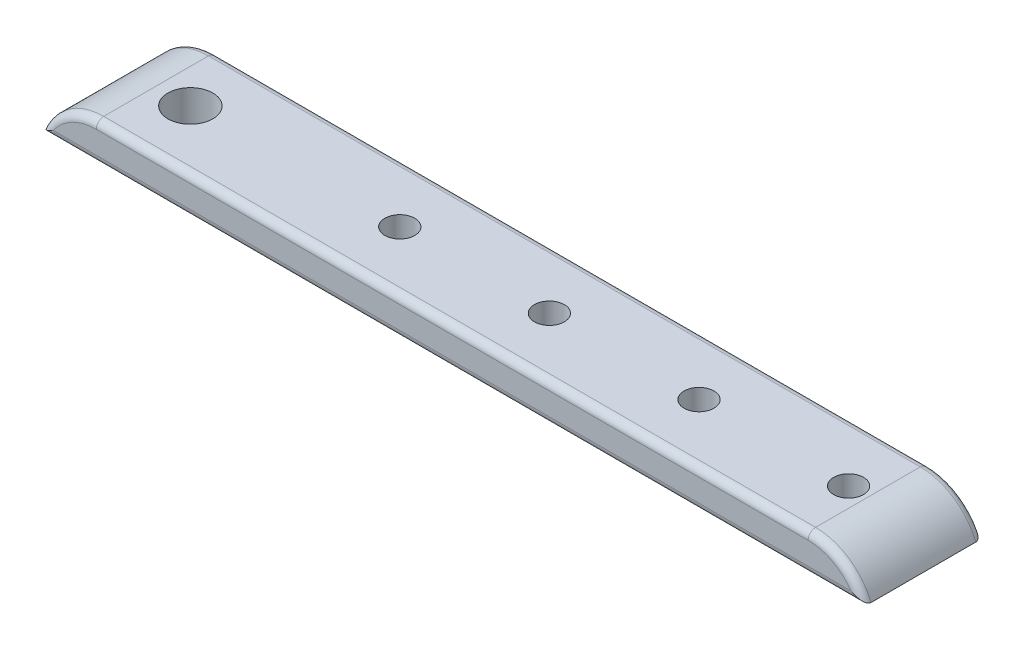
ISO-10303-21;
HEADER;
FILE_DESCRIPTION(('STEP AP214'),'2;1');
FILE_NAME('part.step','',(''),(''),'','','');
FILE_SCHEMA(('AUTOMOTIVE_DESIGN { 1 0 10303 214 1 1 1 1 }'));
ENDSEC;
DATA;
#1=APPLICATION_CONTEXT('core data for automotive mechanical design processes');
#2=APPLICATION_PROTOCOL_DEFINITION('international standard','automotive_design',2000,#1);
#3=PRODUCT_CONTEXT('',#1,'mechanical');
#4=PRODUCT('Part','Part','',(#3));
#5=PRODUCT_RELATED_PRODUCT_CATEGORY('part','',(#4));
#6=PRODUCT_DEFINITION_FORMATION('','',#4);
#7=PRODUCT_DEFINITION_CONTEXT('part definition',#1,'design');
#8=PRODUCT_DEFINITION('design','',#6,#7);
#9=PRODUCT_DEFINITION_SHAPE('','',#8);
#10=(LENGTH_UNIT() NAMED_UNIT(*) SI_UNIT(.MILLI.,.METRE.));
#11=(NAMED_UNIT(*) PLANE_ANGLE_UNIT() SI_UNIT($,.RADIAN.));
#12=(NAMED_UNIT(*) SI_UNIT($,.STERADIAN.) SOLID_ANGLE_UNIT());
#13=UNCERTAINTY_MEASURE_WITH_UNIT(LENGTH_MEASURE(1.E-05),#10,'distance_accuracy_value','');
#14=(GEOMETRIC_REPRESENTATION_CONTEXT(3) GLOBAL_UNCERTAINTY_ASSIGNED_CONTEXT((#13)) GLOBAL_UNIT_ASSIGNED_CONTEXT((#10,
#11,#12)) REPRESENTATION_CONTEXT('',''));
#15=CARTESIAN_POINT('',(0.,0.,0.));
#16=DIRECTION('',(0.,0.,1.));
#17=DIRECTION('',(1.,0.,0.));
#18=AXIS2_PLACEMENT_3D('',#15,#16,#17);
#19=CARTESIAN_POINT('',(-55.,5.,-8.));
#20=DIRECTION('',(0.,0.,1.));
#21=DIRECTION('',(1.,0.,0.));
#22=AXIS2_PLACEMENT_3D('',#19,#20,#21);
#23=PLANE('',#22);
#24=CARTESIAN_POINT('',(47.5838015129044,-3.,-8.));
#25=DIRECTION('',(0.,0.,1.));
#26=DIRECTION('',(1.,0.,0.));
#27=AXIS2_PLACEMENT_3D('',#24,#25,#26);
#28=CIRCLE('',#27,7.);
#29=CARTESIAN_POINT('',(47.5838015129044,4.,-8.));
#30=VERTEX_POINT('',#29);
#31=CARTESIAN_POINT('',(53.3283641594424,1.,-8.));
#32=VERTEX_POINT('',#31);
#33=EDGE_CURVE('E157',#30,#32,#28,.F.);
#34=ORIENTED_EDGE('',*,*,#33,.T.);
#35=DIRECTION('',(-1.,0.,0.));
#36=VECTOR('',#35,1.);
#37=CARTESIAN_POINT('',(-55.,1.,-8.));
#38=LINE('',#37,#36);
#39=CARTESIAN_POINT('',(-53.3283641594423,1.,-8.));
#40=VERTEX_POINT('',#39);
#41=EDGE_CURVE('E65',#32,#40,#38,.T.);
#42=ORIENTED_EDGE('',*,*,#41,.T.);
#43=CARTESIAN_POINT('',(-47.5838015129043,-3.,-8.));
#44=DIRECTION('',(0.,0.,1.));
#45=DIRECTION('',(1.,0.,0.));
#46=AXIS2_PLACEMENT_3D('',#43,#44,#45);
#47=CIRCLE('',#46,7.);
#48=CARTESIAN_POINT('',(-47.5838015129043,4.,-8.));
#49=VERTEX_POINT('',#48);
#50=EDGE_CURVE('E155',#40,#49,#47,.F.);
#51=ORIENTED_EDGE('',*,*,#50,.T.);
#52=DIRECTION('',(-1.,0.,0.));
#53=VECTOR('',#52,1.);
#54=CARTESIAN_POINT('',(47.5838015129044,4.,-8.));
#55=LINE('',#54,#53);
#56=EDGE_CURVE('E153',#49,#30,#55,.F.);
#57=ORIENTED_EDGE('',*,*,#56,.T.);
#58=EDGE_LOOP('',(#34,#42,#51,#57));
#59=FACE_BOUND('',#58,.T.);
#60=ADVANCED_FACE('F41',(#59),#23,.F.);
#61=CARTESIAN_POINT('',(-55.,5.,8.));
#62=DIRECTION('',(0.,0.,-1.));
#63=DIRECTION('',(-1.,0.,0.));
#64=AXIS2_PLACEMENT_3D('',#61,#62,#63);
#65=PLANE('',#64);
#66=CARTESIAN_POINT('',(-47.5838015129043,-3.,8.));
#67=DIRECTION('',(0.,0.,-1.));
#68=DIRECTION('',(-1.,0.,0.));
#69=AXIS2_PLACEMENT_3D('',#66,#67,#68);
#70=CIRCLE('',#69,7.);
#71=CARTESIAN_POINT('',(-47.5838015129043,4.,8.));
#72=VERTEX_POINT('',#71);
#73=CARTESIAN_POINT('',(-53.3283641594423,1.,8.));
#74=VERTEX_POINT('',#73);
#75=EDGE_CURVE('E120',#72,#74,#70,.F.);
#76=ORIENTED_EDGE('',*,*,#75,.T.);
#77=DIRECTION('',(1.,0.,0.));
#78=VECTOR('',#77,1.);
#79=CARTESIAN_POINT('',(-55.,1.,8.));
#80=LINE('',#79,#78);
#81=CARTESIAN_POINT('',(53.3283641594424,1.,8.));
#82=VERTEX_POINT('',#81);
#83=EDGE_CURVE('E116',#74,#82,#80,.T.);
#84=ORIENTED_EDGE('',*,*,#83,.T.);
#85=CARTESIAN_POINT('',(47.5838015129044,-3.,8.));
#86=DIRECTION('',(0.,0.,-1.));
#87=DIRECTION('',(-1.,0.,0.));
#88=AXIS2_PLACEMENT_3D('',#85,#86,#87);
#89=CIRCLE('',#88,7.);
#90=CARTESIAN_POINT('',(47.5838015129044,4.,8.));
#91=VERTEX_POINT('',#90);
#92=EDGE_CURVE('E108',#82,#91,#89,.F.);
#93=ORIENTED_EDGE('',*,*,#92,.T.);
#94=DIRECTION('',(1.,0.,0.));
#95=VECTOR('',#94,1.);
#96=CARTESIAN_POINT('',(-47.5838015129043,4.,8.));
#97=LINE('',#96,#95);
#98=EDGE_CURVE('E113',#91,#72,#97,.F.);
#99=ORIENTED_EDGE('',*,*,#98,.T.);
#100=EDGE_LOOP('',(#76,#84,#93,#99));
#101=FACE_BOUND('',#100,.T.);
#102=ADVANCED_FACE('F111',(#101),#65,.F.);
#103=CARTESIAN_POINT('',(0.,5.,0.));
#104=DIRECTION('',(0.,1.,0.));
#105=DIRECTION('',(0.,0.,1.));
#106=AXIS2_PLACEMENT_3D('',#103,#104,#105);
#107=PLANE('',#106);
#108=CARTESIAN_POINT('',(-15.,5.,0.));
#109=DIRECTION('',(0.,1.,0.));
#110=DIRECTION('',(0.,0.,1.));
#111=AXIS2_PLACEMENT_3D('',#108,#109,#110);
#112=CIRCLE('',#111,2.);
#113=CARTESIAN_POINT('',(-15.,5.,2.));
#114=VERTEX_POINT('',#113);
#115=EDGE_CURVE('E270',#114,#114,#112,.T.);
#116=ORIENTED_EDGE('',*,*,#115,.F.);
#117=EDGE_LOOP('',(#116));
#118=FACE_BOUND('',#117,.T.);
#119=CARTESIAN_POINT('',(5.,5.,0.));
#120=DIRECTION('',(0.,1.,0.));
#121=DIRECTION('',(0.,0.,1.));
#122=AXIS2_PLACEMENT_3D('',#119,#120,#121);
#123=CIRCLE('',#122,2.);
#124=CARTESIAN_POINT('',(5.,5.,2.));
#125=VERTEX_POINT('',#124);
#126=EDGE_CURVE('E267',#125,#125,#123,.T.);
#127=ORIENTED_EDGE('',*,*,#126,.F.);
#128=EDGE_LOOP('',(#127));
#129=FACE_BOUND('',#128,.T.);
#130=CARTESIAN_POINT('',(25.,5.,0.));
#131=DIRECTION('',(0.,1.,0.));
#132=DIRECTION('',(0.,0.,1.));
#133=AXIS2_PLACEMENT_3D('',#130,#131,#132);
#134=CIRCLE('',#133,2.);
#135=CARTESIAN_POINT('',(25.,5.,2.));
#136=VERTEX_POINT('',#135);
#137=EDGE_CURVE('E261',#136,#136,#134,.T.);
#138=ORIENTED_EDGE('',*,*,#137,.F.);
#139=EDGE_LOOP('',(#138));
#140=FACE_BOUND('',#139,.T.);
#141=CARTESIAN_POINT('',(45.,5.,0.));
#142=DIRECTION('',(0.,1.,0.));
#143=DIRECTION('',(0.,0.,1.));
#144=AXIS2_PLACEMENT_3D('',#141,#142,#143);
#145=CIRCLE('',#144,2.);
#146=CARTESIAN_POINT('',(45.,5.,2.));
#147=VERTEX_POINT('',#146);
#148=EDGE_CURVE('E255',#147,#147,#145,.T.);
#149=ORIENTED_EDGE('',*,*,#148,.F.);
#150=EDGE_LOOP('',(#149));
#151=FACE_BOUND('',#150,.T.);
#152=CARTESIAN_POINT('',(-43.,5.,0.));
#153=DIRECTION('',(0.,1.,0.));
#154=DIRECTION('',(0.,0.,1.));
#155=AXIS2_PLACEMENT_3D('',#152,#153,#154);
#156=CIRCLE('',#155,3.);
#157=CARTESIAN_POINT('',(-43.,5.,3.));
#158=VERTEX_POINT('',#157);
#159=EDGE_CURVE('E247',#158,#158,#156,.T.);
#160=ORIENTED_EDGE('',*,*,#159,.F.);
#161=EDGE_LOOP('',(#160));
#162=FACE_BOUND('',#161,.T.);
#163=DIRECTION('',(0.,0.,-1.));
#164=VECTOR('',#163,1.);
#165=CARTESIAN_POINT('',(-47.5838015129043,5.,8.));
#166=LINE('',#165,#164);
#167=CARTESIAN_POINT('',(-47.5838015129043,5.,-7.));
#168=VERTEX_POINT('',#167);
#169=CARTESIAN_POINT('',(-47.5838015129043,5.,7.));
#170=VERTEX_POINT('',#169);
#171=EDGE_CURVE('E138',#168,#170,#166,.F.);
#172=ORIENTED_EDGE('',*,*,#171,.T.);
#173=DIRECTION('',(1.,0.,0.));
#174=VECTOR('',#173,1.);
#175=CARTESIAN_POINT('',(47.5838015129044,5.,7.));
#176=LINE('',#175,#174);
#177=CARTESIAN_POINT('',(47.5838015129044,5.,7.));
#178=VERTEX_POINT('',#177);
#179=EDGE_CURVE('E11',#170,#178,#176,.T.);
#180=ORIENTED_EDGE('',*,*,#179,.T.);
#181=DIRECTION('',(0.,0.,1.));
#182=VECTOR('',#181,1.);
#183=CARTESIAN_POINT('',(47.5838015129044,5.,-7.99999999999999));
#184=LINE('',#183,#182);
#185=CARTESIAN_POINT('',(47.5838015129044,5.,-7.));
#186=VERTEX_POINT('',#185);
#187=EDGE_CURVE('E135',#178,#186,#184,.F.);
#188=ORIENTED_EDGE('',*,*,#187,.T.);
#189=DIRECTION('',(-1.,0.,0.));
#190=VECTOR('',#189,1.);
#191=CARTESIAN_POINT('',(-47.5838015129043,5.,-7.));
#192=LINE('',#191,#190);
#193=EDGE_CURVE('E50',#186,#168,#192,.T.);
#194=ORIENTED_EDGE('',*,*,#193,.T.);
#195=EDGE_LOOP('',(#172,#180,#188,#194));
#196=FACE_BOUND('',#195,.T.);
#197=ADVANCED_FACE('F230',(#118,#129,#140,#151,#162,#196),#107,.T.);
#198=CARTESIAN_POINT('',(0.,0.,0.));
#199=DIRECTION('',(0.,1.,0.));
#200=DIRECTION('',(0.,0.,1.));
#201=AXIS2_PLACEMENT_3D('',#198,#199,#200);
#202=PLANE('',#201);
#203=CARTESIAN_POINT('',(-15.,0.,0.));
#204=DIRECTION('',(0.,1.,0.));
#205=DIRECTION('',(0.,0.,1.));
#206=AXIS2_PLACEMENT_3D('',#203,#204,#205);
#207=CIRCLE('',#206,2.);
#208=CARTESIAN_POINT('',(-15.,0.,2.));
#209=VERTEX_POINT('',#208);
#210=EDGE_CURVE('E251',#209,#209,#207,.T.);
#211=ORIENTED_EDGE('',*,*,#210,.T.);
#212=EDGE_LOOP('',(#211));
#213=FACE_BOUND('',#212,.T.);
#214=CARTESIAN_POINT('',(5.,0.,0.));
#215=DIRECTION('',(0.,1.,0.));
#216=DIRECTION('',(0.,0.,1.));
#217=AXIS2_PLACEMENT_3D('',#214,#215,#216);
#218=CIRCLE('',#217,2.);
#219=CARTESIAN_POINT('',(5.,0.,2.));
#220=VERTEX_POINT('',#219);
#221=EDGE_CURVE('E264',#220,#220,#218,.T.);
#222=ORIENTED_EDGE('',*,*,#221,.T.);
#223=EDGE_LOOP('',(#222));
#224=FACE_BOUND('',#223,.T.);
#225=CARTESIAN_POINT('',(25.,0.,0.));
#226=DIRECTION('',(0.,1.,0.));
#227=DIRECTION('',(0.,0.,1.));
#228=AXIS2_PLACEMENT_3D('',#225,#226,#227);
#229=CIRCLE('',#228,2.);
#230=CARTESIAN_POINT('',(25.,0.,2.));
#231=VERTEX_POINT('',#230);
#232=EDGE_CURVE('E258',#231,#231,#229,.T.);
#233=ORIENTED_EDGE('',*,*,#232,.T.);
#234=EDGE_LOOP('',(#233));
#235=FACE_BOUND('',#234,.T.);
#236=CARTESIAN_POINT('',(45.,0.,0.));
#237=DIRECTION('',(0.,1.,0.));
#238=DIRECTION('',(0.,0.,1.));
#239=AXIS2_PLACEMENT_3D('',#236,#237,#238);
#240=CIRCLE('',#239,2.);
#241=CARTESIAN_POINT('',(45.,0.,2.));
#242=VERTEX_POINT('',#241);
#243=EDGE_CURVE('E129',#242,#242,#240,.T.);
#244=ORIENTED_EDGE('',*,*,#243,.T.);
#245=EDGE_LOOP('',(#244));
#246=FACE_BOUND('',#245,.T.);
#247=CARTESIAN_POINT('',(-43.,0.,0.));
#248=DIRECTION('',(0.,1.,0.));
#249=DIRECTION('',(0.,0.,1.));
#250=AXIS2_PLACEMENT_3D('',#247,#248,#249);
#251=CIRCLE('',#250,3.);
#252=CARTESIAN_POINT('',(-43.,0.,3.));
#253=VERTEX_POINT('',#252);
#254=EDGE_CURVE('E243',#253,#253,#251,.T.);
#255=ORIENTED_EDGE('',*,*,#254,.T.);
#256=EDGE_LOOP('',(#255));
#257=FACE_BOUND('',#256,.T.);
#258=DIRECTION('',(0.,0.,-1.));
#259=VECTOR('',#258,1.);
#260=CARTESIAN_POINT('',(55.,0.,-8.));
#261=LINE('',#260,#259);
#262=CARTESIAN_POINT('',(55.,0.,7.));
#263=VERTEX_POINT('',#262);
#264=CARTESIAN_POINT('',(55.,0.,-7.));
#265=VERTEX_POINT('',#264);
#266=EDGE_CURVE('E229',#263,#265,#261,.T.);
#267=ORIENTED_EDGE('',*,*,#266,.F.);
#268=DIRECTION('',(1.,0.,0.));
#269=VECTOR('',#268,1.);
#270=CARTESIAN_POINT('',(0.,0.,7.));
#271=LINE('',#270,#269);
#272=CARTESIAN_POINT('',(-55.,0.,7.));
#273=VERTEX_POINT('',#272);
#274=EDGE_CURVE('E162',#263,#273,#271,.F.);
#275=ORIENTED_EDGE('',*,*,#274,.T.);
#276=DIRECTION('',(0.,0.,1.));
#277=VECTOR('',#276,1.);
#278=CARTESIAN_POINT('',(-55.,0.,-8.));
#279=LINE('',#278,#277);
#280=CARTESIAN_POINT('',(-55.,0.,-7.));
#281=VERTEX_POINT('',#280);
#282=EDGE_CURVE('E237',#281,#273,#279,.T.);
#283=ORIENTED_EDGE('',*,*,#282,.F.);
#284=DIRECTION('',(-1.,0.,0.));
#285=VECTOR('',#284,1.);
#286=CARTESIAN_POINT('',(0.,0.,-7.));
#287=LINE('',#286,#285);
#288=EDGE_CURVE('E160',#281,#265,#287,.F.);
#289=ORIENTED_EDGE('',*,*,#288,.T.);
#290=EDGE_LOOP('',(#267,#275,#283,#289));
#291=FACE_BOUND('',#290,.T.);
#292=ADVANCED_FACE('F242',(#213,#224,#235,#246,#257,#291),#202,.F.);
#293=CARTESIAN_POINT('',(-43.,0.,0.));
#294=DIRECTION('',(0.,1.,0.));
#295=DIRECTION('',(0.,0.,1.));
#296=AXIS2_PLACEMENT_3D('',#293,#294,#295);
#297=CYLINDRICAL_SURFACE('',#296,3.);
#298=ORIENTED_EDGE('',*,*,#254,.F.);
#299=EDGE_LOOP('',(#298));
#300=FACE_BOUND('',#299,.T.);
#301=ORIENTED_EDGE('',*,*,#159,.T.);
#302=EDGE_LOOP('',(#301));
#303=FACE_BOUND('',#302,.T.);
#304=ADVANCED_FACE('F296',(#300,#303),#297,.F.);
#305=CARTESIAN_POINT('',(45.,0.,0.));
#306=DIRECTION('',(0.,1.,0.));
#307=DIRECTION('',(0.,0.,1.));
#308=AXIS2_PLACEMENT_3D('',#305,#306,#307);
#309=CYLINDRICAL_SURFACE('',#308,2.);
#310=ORIENTED_EDGE('',*,*,#243,.F.);
#311=EDGE_LOOP('',(#310));
#312=FACE_BOUND('',#311,.T.);
#313=ORIENTED_EDGE('',*,*,#148,.T.);
#314=EDGE_LOOP('',(#313));
#315=FACE_BOUND('',#314,.T.);
#316=ADVANCED_FACE('F298',(#312,#315),#309,.F.);
#317=CARTESIAN_POINT('',(25.,0.,0.));
#318=DIRECTION('',(0.,1.,0.));
#319=DIRECTION('',(0.,0.,1.));
#320=AXIS2_PLACEMENT_3D('',#317,#318,#319);
#321=CYLINDRICAL_SURFACE('',#320,2.);
#322=ORIENTED_EDGE('',*,*,#232,.F.);
#323=EDGE_LOOP('',(#322));
#324=FACE_BOUND('',#323,.T.);
#325=ORIENTED_EDGE('',*,*,#137,.T.);
#326=EDGE_LOOP('',(#325));
#327=FACE_BOUND('',#326,.T.);
#328=ADVANCED_FACE('F304',(#324,#327),#321,.F.);
#329=CARTESIAN_POINT('',(5.,0.,0.));
#330=DIRECTION('',(0.,1.,0.));
#331=DIRECTION('',(0.,0.,1.));
#332=AXIS2_PLACEMENT_3D('',#329,#330,#331);
#333=CYLINDRICAL_SURFACE('',#332,2.);
#334=ORIENTED_EDGE('',*,*,#221,.F.);
#335=EDGE_LOOP('',(#334));
#336=FACE_BOUND('',#335,.T.);
#337=ORIENTED_EDGE('',*,*,#126,.T.);
#338=EDGE_LOOP('',(#337));
#339=FACE_BOUND('',#338,.T.);
#340=ADVANCED_FACE('F281',(#336,#339),#333,.F.);
#341=CARTESIAN_POINT('',(-15.,0.,0.));
#342=DIRECTION('',(0.,1.,0.));
#343=DIRECTION('',(0.,0.,1.));
#344=AXIS2_PLACEMENT_3D('',#341,#342,#343);
#345=CYLINDRICAL_SURFACE('',#344,2.);
#346=ORIENTED_EDGE('',*,*,#210,.F.);
#347=EDGE_LOOP('',(#346));
#348=FACE_BOUND('',#347,.T.);
#349=ORIENTED_EDGE('',*,*,#115,.T.);
#350=EDGE_LOOP('',(#349));
#351=FACE_BOUND('',#350,.T.);
#352=ADVANCED_FACE('F278',(#348,#351),#345,.F.);
#353=CARTESIAN_POINT('',(47.5838015129044,-3.,-7.99999999999999));
#354=DIRECTION('',(0.,0.,-1.));
#355=DIRECTION('',(-1.,0.,0.));
#356=AXIS2_PLACEMENT_3D('',#353,#354,#355);
#357=CYLINDRICAL_SURFACE('',#356,8.);
#358=ORIENTED_EDGE('',*,*,#187,.F.);
#359=CARTESIAN_POINT('',(47.5838015129044,-3.,7.));
#360=DIRECTION('',(0.,0.,-1.));
#361=DIRECTION('',(-1.,0.,0.));
#362=AXIS2_PLACEMENT_3D('',#359,#360,#361);
#363=CIRCLE('',#362,8.);
#364=EDGE_CURVE('E126',#178,#263,#363,.T.);
#365=ORIENTED_EDGE('',*,*,#364,.T.);
#366=ORIENTED_EDGE('',*,*,#266,.T.);
#367=CARTESIAN_POINT('',(47.5838015129044,-3.,-7.));
#368=DIRECTION('',(0.,0.,1.));
#369=DIRECTION('',(1.,0.,0.));
#370=AXIS2_PLACEMENT_3D('',#367,#368,#369);
#371=CIRCLE('',#370,8.);
#372=EDGE_CURVE('E149',#265,#186,#371,.T.);
#373=ORIENTED_EDGE('',*,*,#372,.T.);
#374=EDGE_LOOP('',(#358,#365,#366,#373));
#375=FACE_BOUND('',#374,.T.);
#376=ADVANCED_FACE('F227',(#375),#357,.T.);
#377=CARTESIAN_POINT('',(-47.5838015129043,-3.,-8.));
#378=DIRECTION('',(0.,0.,1.));
#379=DIRECTION('',(1.,0.,0.));
#380=AXIS2_PLACEMENT_3D('',#377,#378,#379);
#381=CYLINDRICAL_SURFACE('',#380,8.);
#382=ORIENTED_EDGE('',*,*,#282,.T.);
#383=CARTESIAN_POINT('',(-47.5838015129043,-3.,7.));
#384=DIRECTION('',(0.,0.,-1.));
#385=DIRECTION('',(-1.,0.,0.));
#386=AXIS2_PLACEMENT_3D('',#383,#384,#385);
#387=CIRCLE('',#386,8.);
#388=EDGE_CURVE('E146',#273,#170,#387,.T.);
#389=ORIENTED_EDGE('',*,*,#388,.T.);
#390=ORIENTED_EDGE('',*,*,#171,.F.);
#391=CARTESIAN_POINT('',(-47.5838015129043,-3.,-7.));
#392=DIRECTION('',(0.,0.,1.));
#393=DIRECTION('',(1.,0.,0.));
#394=AXIS2_PLACEMENT_3D('',#391,#392,#393);
#395=CIRCLE('',#394,8.);
#396=EDGE_CURVE('E144',#168,#281,#395,.T.);
#397=ORIENTED_EDGE('',*,*,#396,.T.);
#398=EDGE_LOOP('',(#382,#389,#390,#397));
#399=FACE_BOUND('',#398,.T.);
#400=ADVANCED_FACE('F234',(#399),#381,.T.);
#401=CARTESIAN_POINT('',(47.5838015129044,-3.,7.));
#402=DIRECTION('',(0.,0.,-1.));
#403=DIRECTION('',(-1.,0.,0.));
#404=AXIS2_PLACEMENT_3D('',#401,#402,#403);
#405=TOROIDAL_SURFACE('',#404,7.,1.);
#406=CARTESIAN_POINT('',(55.,0.,7.));
#407=CARTESIAN_POINT('',(55.0000055691165,-4.10067418715581E-06,7.01971434464541));
#408=CARTESIAN_POINT('',(54.9991344724845,0.000583561715815952,7.03941317275482));
#409=CARTESIAN_POINT('',(54.9956986419898,0.00289934516778807,7.0785677657083));
#410=CARTESIAN_POINT('',(54.9931362924788,0.00462586065676235,7.09802383351018));
#411=CARTESIAN_POINT('',(54.9830919206207,0.0113885039688366,7.15525821131013));
#412=CARTESIAN_POINT('',(54.9732488535439,0.0180103828433714,7.19246067117475));
#413=CARTESIAN_POINT('',(54.9482876432851,0.0347497802609657,7.26389113645407));
#414=CARTESIAN_POINT('',(54.9331969653446,0.0448490957492836,7.29813349169633));
#415=CARTESIAN_POINT('',(54.8987987975059,0.0677778511973828,7.36354843688757));
#416=CARTESIAN_POINT('',(54.8794764211065,0.0806169250365434,7.39470961134502));
#417=CARTESIAN_POINT('',(54.8257439731723,0.116151589797155,7.4705666772047));
#418=CARTESIAN_POINT('',(54.7889946126696,0.140305790967152,7.5129075953041));
#419=CARTESIAN_POINT('',(54.7103554265663,0.19153574503481,7.59038174357726));
#420=CARTESIAN_POINT('',(54.6684544913769,0.218617796244475,7.62549894393553));
#421=CARTESIAN_POINT('',(54.5874344961908,0.270478485360031,7.68492378623686));
#422=CARTESIAN_POINT('',(54.5487690998788,0.295035879916669,7.71005862398617));
#423=CARTESIAN_POINT('',(54.4695539008021,0.344908579019511,7.7563140857134));
#424=CARTESIAN_POINT('',(54.4290027304195,0.370224428732378,7.77743173797972));
#425=CARTESIAN_POINT('',(54.305126394033,0.446844898079819,7.83555409089683));
#426=CARTESIAN_POINT('',(54.2196774100242,0.49875878696406,7.86726017145435));
#427=CARTESIAN_POINT('',(54.0685507309179,0.588734522659448,7.91250814540398));
#428=CARTESIAN_POINT('',(54.0036127671964,0.626833032158409,7.92863581533005));
#429=CARTESIAN_POINT('',(53.8723912459825,0.702633885101941,7.95561082059031));
#430=CARTESIAN_POINT('',(53.8061070695446,0.740336033642854,7.9664556670541));
#431=CARTESIAN_POINT('',(53.6060158861957,0.852303034910222,7.99199511233426));
#432=CARTESIAN_POINT('',(53.4707116586809,0.925582874889202,7.99976565056791));
#433=CARTESIAN_POINT('',(53.3324895208556,0.997845023587162,7.99999824371801));
#434=CARTESIAN_POINT('',(53.3304269363019,0.998922753577879,7.99999998399985));
#435=CARTESIAN_POINT('',(53.3283641594424,1.,8.));
#436=B_SPLINE_CURVE_WITH_KNOTS('',3,(#406,#407,#408,#409,#410,#411,#412,#413,#414,#415,#416,
#417,#418,#419,#420,#421,#422,#423,#424,#425,#426,#427,#428,#429,#430,#431,#432,#433,#434,#435),
.UNSPECIFIED.,.F.,.F.,(4,2,2,2,2,2,2,2,2,2,2,2,2,2,4),(0.,0.059086524763124,0.11808992594616,
0.234454580064503,0.350219143802573,0.466397686065521,0.64850900998604,0.831020189961681,
0.987538874287494,1.14417289679551,1.45784444864616,1.68865847977304,1.91958114825107,
2.38050478096388,2.38748631183945),.UNSPECIFIED.);
#437=EDGE_CURVE('E130',#263,#82,#436,.T.);
#438=ORIENTED_EDGE('',*,*,#437,.F.);
#439=ORIENTED_EDGE('',*,*,#364,.F.);
#440=CARTESIAN_POINT('',(47.5838015129044,4.,7.));
#441=DIRECTION('',(-1.,0.,0.));
#442=DIRECTION('',(0.,0.,1.));
#443=AXIS2_PLACEMENT_3D('',#440,#441,#442);
#444=CIRCLE('',#443,1.);
#445=EDGE_CURVE('E124',#91,#178,#444,.T.);
#446=ORIENTED_EDGE('',*,*,#445,.F.);
#447=ORIENTED_EDGE('',*,*,#92,.F.);
#448=EDGE_LOOP('',(#438,#439,#446,#447));
#449=FACE_BOUND('',#448,.T.);
#450=ADVANCED_FACE('F125',(#449),#405,.T.);
#451=CARTESIAN_POINT('',(0.,4.,7.));
#452=DIRECTION('',(-1.,0.,0.));
#453=DIRECTION('',(0.,0.,1.));
#454=AXIS2_PLACEMENT_3D('',#451,#452,#453);
#455=CYLINDRICAL_SURFACE('',#454,1.);
#456=ORIENTED_EDGE('',*,*,#445,.T.);
#457=ORIENTED_EDGE('',*,*,#179,.F.);
#458=CARTESIAN_POINT('',(-47.5838015129043,4.,7.));
#459=DIRECTION('',(-1.,0.,0.));
#460=DIRECTION('',(0.,0.,1.));
#461=AXIS2_PLACEMENT_3D('',#458,#459,#460);
#462=CIRCLE('',#461,1.);
#463=EDGE_CURVE('E133',#72,#170,#462,.T.);
#464=ORIENTED_EDGE('',*,*,#463,.F.);
#465=ORIENTED_EDGE('',*,*,#98,.F.);
#466=EDGE_LOOP('',(#456,#457,#464,#465));
#467=FACE_BOUND('',#466,.T.);
#468=ADVANCED_FACE('F132',(#467),#455,.T.);
#469=CARTESIAN_POINT('',(-55.,1.,7.));
#470=DIRECTION('',(1.,0.,0.));
#471=DIRECTION('',(0.,0.,-1.));
#472=AXIS2_PLACEMENT_3D('',#469,#470,#471);
#473=CYLINDRICAL_SURFACE('',#472,1.);
#474=ORIENTED_EDGE('',*,*,#437,.T.);
#475=ORIENTED_EDGE('',*,*,#83,.F.);
#476=CARTESIAN_POINT('',(-55.,0.,7.));
#477=CARTESIAN_POINT('',(-55.0000055691164,-4.10067418712131E-06,7.01971434464541));
#478=CARTESIAN_POINT('',(-54.9991344724844,0.000583561715815976,7.03941317275482));
#479=CARTESIAN_POINT('',(-54.9956986419898,0.00289934516778805,7.0785677657083));
#480=CARTESIAN_POINT('',(-54.9931362924788,0.00462586065676232,7.09802383351018));
#481=CARTESIAN_POINT('',(-54.9830919206207,0.0113885039688366,7.15525821131013));
#482=CARTESIAN_POINT('',(-54.9732488535438,0.0180103828433714,7.19246067117475));
#483=CARTESIAN_POINT('',(-54.948287643285,0.0347497802609658,7.26389113645407));
#484=CARTESIAN_POINT('',(-54.9331969653445,0.0448490957492841,7.29813349169634));
#485=CARTESIAN_POINT('',(-54.8987987975058,0.0677778511973832,7.36354843688757));
#486=CARTESIAN_POINT('',(-54.8794764211064,0.0806169250365435,7.39470961134502));
#487=CARTESIAN_POINT('',(-54.8257439731722,0.116151589797155,7.4705666772047));
#488=CARTESIAN_POINT('',(-54.7889946126695,0.140305790967153,7.5129075953041));
#489=CARTESIAN_POINT('',(-54.7103554265663,0.191535745034811,7.59038174357726));
#490=CARTESIAN_POINT('',(-54.6684544913768,0.218617796244475,7.62549894393553));
#491=CARTESIAN_POINT('',(-54.5874344961907,0.270478485360032,7.68492378623686));
#492=CARTESIAN_POINT('',(-54.5487690998787,0.295035879916672,7.71005862398618));
#493=CARTESIAN_POINT('',(-54.469553900802,0.344908579019515,7.75631408571341));
#494=CARTESIAN_POINT('',(-54.4290027304194,0.370224428732381,7.77743173797973));
#495=CARTESIAN_POINT('',(-54.3051263940329,0.446844898079821,7.83555409089683));
#496=CARTESIAN_POINT('',(-54.2196774100241,0.498758786964062,7.86726017145435));
#497=CARTESIAN_POINT('',(-54.0685507309178,0.588734522659448,7.91250814540398));
#498=CARTESIAN_POINT('',(-54.0036127671963,0.626833032158409,7.92863581533005));
#499=CARTESIAN_POINT('',(-53.8723912459824,0.702633885101941,7.95561082059031));
#500=CARTESIAN_POINT('',(-53.8061070695446,0.740336033642856,7.9664556670541));
#501=CARTESIAN_POINT('',(-53.6060158861956,0.852303034910226,7.99199511233426));
#502=CARTESIAN_POINT('',(-53.4707116586808,0.925582874889204,7.99976565056791));
#503=CARTESIAN_POINT('',(-53.3324895208556,0.997845023587162,7.99999824371801));
#504=CARTESIAN_POINT('',(-53.3304269363019,0.998922753577879,7.99999998399985));
#505=CARTESIAN_POINT('',(-53.3283641594423,1.,8.));
#506=B_SPLINE_CURVE_WITH_KNOTS('',3,(#476,#477,#478,#479,#480,#481,#482,#483,#484,#485,#486,
#487,#488,#489,#490,#491,#492,#493,#494,#495,#496,#497,#498,#499,#500,#501,#502,#503,#504,#505),
.UNSPECIFIED.,.F.,.F.,(4,2,2,2,2,2,2,2,2,2,2,2,2,2,4),(0.,0.0590865247631231,0.11808992594616,
0.234454580064503,0.350219143802574,0.466397686065521,0.648509009986042,0.831020189961681,
0.987538874287497,1.14417289679552,1.45784444864616,1.68865847977304,1.91958114825108,
2.38050478096388,2.38748631183945),.UNSPECIFIED.);
#507=EDGE_CURVE('E165',#273,#74,#506,.T.);
#508=ORIENTED_EDGE('',*,*,#507,.F.);
#509=ORIENTED_EDGE('',*,*,#274,.F.);
#510=EDGE_LOOP('',(#474,#475,#508,#509));
#511=FACE_BOUND('',#510,.T.);
#512=ADVANCED_FACE('F177',(#511),#473,.T.);
#513=CARTESIAN_POINT('',(-47.5838015129043,-3.,7.));
#514=DIRECTION('',(0.,0.,-1.));
#515=DIRECTION('',(-1.,0.,0.));
#516=AXIS2_PLACEMENT_3D('',#513,#514,#515);
#517=TOROIDAL_SURFACE('',#516,7.,1.);
#518=ORIENTED_EDGE('',*,*,#463,.T.);
#519=ORIENTED_EDGE('',*,*,#388,.F.);
#520=ORIENTED_EDGE('',*,*,#507,.T.);
#521=ORIENTED_EDGE('',*,*,#75,.F.);
#522=EDGE_LOOP('',(#518,#519,#520,#521));
#523=FACE_BOUND('',#522,.T.);
#524=ADVANCED_FACE('F174',(#523),#517,.T.);
#525=CARTESIAN_POINT('',(-47.5838015129043,-3.,-7.));
#526=DIRECTION('',(0.,0.,1.));
#527=DIRECTION('',(1.,0.,0.));
#528=AXIS2_PLACEMENT_3D('',#525,#526,#527);
#529=TOROIDAL_SURFACE('',#528,7.,1.);
#530=CARTESIAN_POINT('',(-55.,0.,-7.));
#531=CARTESIAN_POINT('',(-55.0000055691164,-4.10067418700705E-06,-7.0197143446454));
#532=CARTESIAN_POINT('',(-54.9991344724844,0.000583561715816073,-7.03941317275481));
#533=CARTESIAN_POINT('',(-54.9956986419898,0.00289934516778807,-7.07856776570829));
#534=CARTESIAN_POINT('',(-54.9931362924788,0.0046258606567623,-7.09802383351018));
#535=CARTESIAN_POINT('',(-54.9830919206207,0.0113885039688366,-7.15525821131013));
#536=CARTESIAN_POINT('',(-54.9732488535438,0.0180103828433718,-7.19246067117475));
#537=CARTESIAN_POINT('',(-54.948287643285,0.0347497802609661,-7.26389113645407));
#538=CARTESIAN_POINT('',(-54.9331969653445,0.0448490957492839,-7.29813349169633));
#539=CARTESIAN_POINT('',(-54.8987987975058,0.0677778511973833,-7.36354843688757));
#540=CARTESIAN_POINT('',(-54.8794764211064,0.0806169250365443,-7.39470961134502));
#541=CARTESIAN_POINT('',(-54.8257439731722,0.116151589797157,-7.4705666772047));
#542=CARTESIAN_POINT('',(-54.7889946126695,0.140305790967155,-7.5129075953041));
#543=CARTESIAN_POINT('',(-54.7103554265663,0.191535745034814,-7.59038174357726));
#544=CARTESIAN_POINT('',(-54.6684544913768,0.218617796244479,-7.62549894393553));
#545=CARTESIAN_POINT('',(-54.5874344961907,0.270478485360032,-7.68492378623685));
#546=CARTESIAN_POINT('',(-54.5487690998787,0.295035879916667,-7.71005862398617));
#547=CARTESIAN_POINT('',(-54.469553900802,0.344908579019505,-7.7563140857134));
#548=CARTESIAN_POINT('',(-54.4290027304195,0.370224428732371,-7.77743173797971));
#549=CARTESIAN_POINT('',(-54.3051263940329,0.446844898079805,-7.83555409089682));
#550=CARTESIAN_POINT('',(-54.2196774100241,0.498758786964021,-7.86726017145434));
#551=CARTESIAN_POINT('',(-54.0685507309178,0.588734522659483,-7.91250814540398));
#552=CARTESIAN_POINT('',(-54.0036127671963,0.626833032158513,-7.92863581533005));
#553=CARTESIAN_POINT('',(-53.8723912459823,0.702633885101885,-7.95561082059032));
#554=CARTESIAN_POINT('',(-53.8061070695444,0.740336033642571,-7.96645566705411));
#555=CARTESIAN_POINT('',(-53.6060158861959,0.852303034910914,-7.99199511233426));
#556=CARTESIAN_POINT('',(-53.4707116586827,0.925582874892789,-7.99976565056791));
#557=CARTESIAN_POINT('',(-53.3324895208556,0.99784502358727,-7.99999824371801));
#558=CARTESIAN_POINT('',(-53.3304269363019,0.998922753577933,-7.99999998399985));
#559=CARTESIAN_POINT('',(-53.3283641594423,1.,-8.));
#560=B_SPLINE_CURVE_WITH_KNOTS('',3,(#530,#531,#532,#533,#534,#535,#536,#537,#538,#539,#540,
#541,#542,#543,#544,#545,#546,#547,#548,#549,#550,#551,#552,#553,#554,#555,#556,#557,#558,#559),
.UNSPECIFIED.,.F.,.F.,(4,2,2,2,2,2,2,2,2,2,2,2,2,2,4),(0.,0.0590865247631231,0.118089925946161,
0.234454580064504,0.350219143802573,0.466397686065522,0.648509009986051,0.831020189961684,
0.987538874287479,1.14417289679548,1.45784444864616,1.68865847977308,1.91958114825118,
2.38050478096389,2.38748631183946),.UNSPECIFIED.);
#561=EDGE_CURVE('E207',#281,#40,#560,.T.);
#562=ORIENTED_EDGE('',*,*,#561,.F.);
#563=ORIENTED_EDGE('',*,*,#396,.F.);
#564=CARTESIAN_POINT('',(-47.5838015129043,4.,-7.));
#565=DIRECTION('',(1.,0.,0.));
#566=DIRECTION('',(0.,0.,-1.));
#567=AXIS2_PLACEMENT_3D('',#564,#565,#566);
#568=CIRCLE('',#567,1.);
#569=EDGE_CURVE('E45',#49,#168,#568,.T.);
#570=ORIENTED_EDGE('',*,*,#569,.F.);
#571=ORIENTED_EDGE('',*,*,#50,.F.);
#572=EDGE_LOOP('',(#562,#563,#570,#571));
#573=FACE_BOUND('',#572,.T.);
#574=ADVANCED_FACE('F204',(#573),#529,.T.);
#575=CARTESIAN_POINT('',(0.,4.,-7.));
#576=DIRECTION('',(1.,0.,0.));
#577=DIRECTION('',(0.,0.,-1.));
#578=AXIS2_PLACEMENT_3D('',#575,#576,#577);
#579=CYLINDRICAL_SURFACE('',#578,1.);
#580=ORIENTED_EDGE('',*,*,#569,.T.);
#581=ORIENTED_EDGE('',*,*,#193,.F.);
#582=CARTESIAN_POINT('',(47.5838015129044,4.,-7.));
#583=DIRECTION('',(1.,0.,0.));
#584=DIRECTION('',(0.,0.,-1.));
#585=AXIS2_PLACEMENT_3D('',#582,#583,#584);
#586=CIRCLE('',#585,1.);
#587=EDGE_CURVE('E197',#30,#186,#586,.T.);
#588=ORIENTED_EDGE('',*,*,#587,.F.);
#589=ORIENTED_EDGE('',*,*,#56,.F.);
#590=EDGE_LOOP('',(#580,#581,#588,#589));
#591=FACE_BOUND('',#590,.T.);
#592=ADVANCED_FACE('F43',(#591),#579,.T.);
#593=CARTESIAN_POINT('',(-55.,1.,-7.));
#594=DIRECTION('',(-1.,0.,0.));
#595=DIRECTION('',(0.,0.,1.));
#596=AXIS2_PLACEMENT_3D('',#593,#594,#595);
#597=CYLINDRICAL_SURFACE('',#596,1.);
#598=ORIENTED_EDGE('',*,*,#561,.T.);
#599=ORIENTED_EDGE('',*,*,#41,.F.);
#600=CARTESIAN_POINT('',(55.,0.,-7.));
#601=CARTESIAN_POINT('',(55.0000055691165,-4.10067418701996E-06,-7.01971434464541));
#602=CARTESIAN_POINT('',(54.9991344724845,0.000583561715816075,-7.03941317275481));
#603=CARTESIAN_POINT('',(54.9956986419898,0.00289934516778811,-7.07856776570829));
#604=CARTESIAN_POINT('',(54.9931362924788,0.00462586065676233,-7.09802383351018));
#605=CARTESIAN_POINT('',(54.9830919206207,0.0113885039688366,-7.15525821131013));
#606=CARTESIAN_POINT('',(54.9732488535439,0.0180103828433718,-7.19246067117475));
#607=CARTESIAN_POINT('',(54.948287643285,0.0347497802609661,-7.26389113645407));
#608=CARTESIAN_POINT('',(54.9331969653446,0.0448490957492839,-7.29813349169633));
#609=CARTESIAN_POINT('',(54.8987987975059,0.0677778511973833,-7.36354843688757));
#610=CARTESIAN_POINT('',(54.8794764211065,0.0806169250365443,-7.39470961134502));
#611=CARTESIAN_POINT('',(54.8257439731723,0.116151589797157,-7.4705666772047));
#612=CARTESIAN_POINT('',(54.7889946126696,0.140305790967155,-7.5129075953041));
#613=CARTESIAN_POINT('',(54.7103554265663,0.191535745034814,-7.59038174357726));
#614=CARTESIAN_POINT('',(54.6684544913769,0.218617796244479,-7.62549894393553));
#615=CARTESIAN_POINT('',(54.5874344961908,0.270478485360032,-7.68492378623685));
#616=CARTESIAN_POINT('',(54.5487690998788,0.295035879916667,-7.71005862398617));
#617=CARTESIAN_POINT('',(54.4695539008021,0.344908579019505,-7.7563140857134));
#618=CARTESIAN_POINT('',(54.4290027304195,0.370224428732371,-7.77743173797971));
#619=CARTESIAN_POINT('',(54.305126394033,0.446844898079805,-7.83555409089682));
#620=CARTESIAN_POINT('',(54.2196774100242,0.498758786964021,-7.86726017145434));
#621=CARTESIAN_POINT('',(54.0685507309179,0.588734522659483,-7.91250814540398));
#622=CARTESIAN_POINT('',(54.0036127671964,0.626833032158513,-7.92863581533005));
#623=CARTESIAN_POINT('',(53.8723912459824,0.702633885101885,-7.95561082059032));
#624=CARTESIAN_POINT('',(53.8061070695444,0.740336033642571,-7.96645566705411));
#625=CARTESIAN_POINT('',(53.6060158861959,0.852303034910914,-7.99199511233426));
#626=CARTESIAN_POINT('',(53.4707116586827,0.925582874892789,-7.99976565056791));
#627=CARTESIAN_POINT('',(53.3324895208557,0.99784502358727,-7.99999824371801));
#628=CARTESIAN_POINT('',(53.3304269363019,0.998922753577933,-7.99999998399985));
#629=CARTESIAN_POINT('',(53.3283641594424,1.,-8.));
#630=B_SPLINE_CURVE_WITH_KNOTS('',3,(#600,#601,#602,#603,#604,#605,#606,#607,#608,#609,#610,
#611,#612,#613,#614,#615,#616,#617,#618,#619,#620,#621,#622,#623,#624,#625,#626,#627,#628,#629),
.UNSPECIFIED.,.F.,.F.,(4,2,2,2,2,2,2,2,2,2,2,2,2,2,4),(0.,0.059086524763124,0.118089925946161,
0.234454580064504,0.350219143802573,0.466397686065522,0.648509009986051,0.831020189961684,
0.987538874287479,1.14417289679548,1.45784444864616,1.68865847977308,1.91958114825118,
2.38050478096389,2.38748631183946),.UNSPECIFIED.);
#631=EDGE_CURVE('E58',#265,#32,#630,.T.);
#632=ORIENTED_EDGE('',*,*,#631,.F.);
#633=ORIENTED_EDGE('',*,*,#288,.F.);
#634=EDGE_LOOP('',(#598,#599,#632,#633));
#635=FACE_BOUND('',#634,.T.);
#636=ADVANCED_FACE('F200',(#635),#597,.T.);
#637=CARTESIAN_POINT('',(47.5838015129044,-3.,-7.));
#638=DIRECTION('',(0.,0.,1.));
#639=DIRECTION('',(1.,0.,0.));
#640=AXIS2_PLACEMENT_3D('',#637,#638,#639);
#641=TOROIDAL_SURFACE('',#640,7.,1.);
#642=ORIENTED_EDGE('',*,*,#587,.T.);
#643=ORIENTED_EDGE('',*,*,#372,.F.);
#644=ORIENTED_EDGE('',*,*,#631,.T.);
#645=ORIENTED_EDGE('',*,*,#33,.F.);
#646=EDGE_LOOP('',(#642,#643,#644,#645));
#647=FACE_BOUND('',#646,.T.);
#648=ADVANCED_FACE('F198',(#647),#641,.T.);
#649=CLOSED_SHELL('',(#60,#102,#197,#292,#304,#316,#328,#340,#352,#376,#400,#450,#468,#512,#524,
#574,#592,#636,#648));
#650=MANIFOLD_SOLID_BREP('B2',#649);
#651=ADVANCED_BREP_SHAPE_REPRESENTATION('',(#18,#650),#14);
#652=SHAPE_DEFINITION_REPRESENTATION(#9,#651);
ENDSEC;
END-ISO-10303-21;
